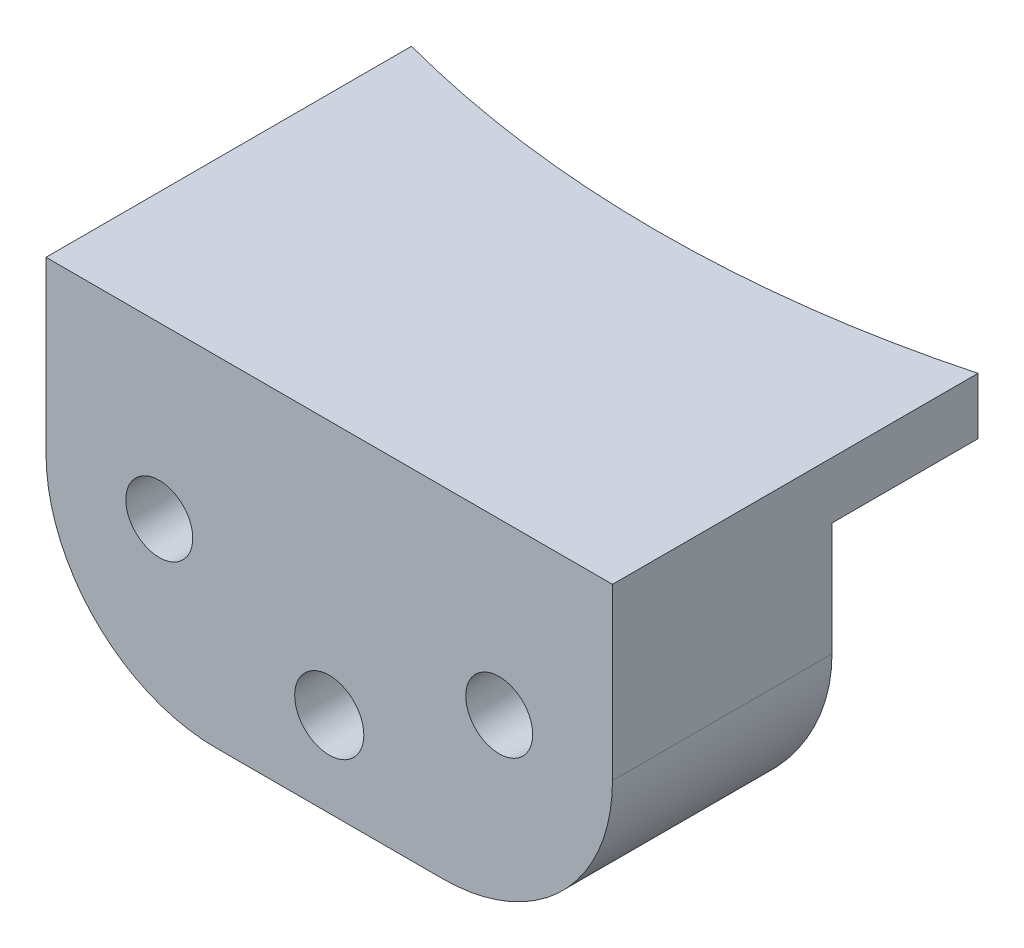
ISO-10303-21;
HEADER;
FILE_DESCRIPTION(('STEP AP214'),'2;1');
FILE_NAME('part.step','',(''),(''),'','','');
FILE_SCHEMA(('AUTOMOTIVE_DESIGN { 1 0 10303 214 1 1 1 1 }'));
ENDSEC;
DATA;
#1=APPLICATION_CONTEXT('core data for automotive mechanical design processes');
#2=APPLICATION_PROTOCOL_DEFINITION('international standard','automotive_design',2000,#1);
#3=PRODUCT_CONTEXT('',#1,'mechanical');
#4=PRODUCT('Part','Part','',(#3));
#5=PRODUCT_RELATED_PRODUCT_CATEGORY('part','',(#4));
#6=PRODUCT_DEFINITION_FORMATION('','',#4);
#7=PRODUCT_DEFINITION_CONTEXT('part definition',#1,'design');
#8=PRODUCT_DEFINITION('design','',#6,#7);
#9=PRODUCT_DEFINITION_SHAPE('','',#8);
#10=(LENGTH_UNIT() NAMED_UNIT(*) SI_UNIT(.MILLI.,.METRE.));
#11=(NAMED_UNIT(*) PLANE_ANGLE_UNIT() SI_UNIT($,.RADIAN.));
#12=(NAMED_UNIT(*) SI_UNIT($,.STERADIAN.) SOLID_ANGLE_UNIT());
#13=UNCERTAINTY_MEASURE_WITH_UNIT(LENGTH_MEASURE(1.E-05),#10,'distance_accuracy_value','');
#14=(GEOMETRIC_REPRESENTATION_CONTEXT(3) GLOBAL_UNCERTAINTY_ASSIGNED_CONTEXT((#13)) GLOBAL_UNIT_ASSIGNED_CONTEXT((#10,
#11,#12)) REPRESENTATION_CONTEXT('',''));
#15=CARTESIAN_POINT('',(0.,0.,0.));
#16=DIRECTION('',(0.,0.,1.));
#17=DIRECTION('',(1.,0.,0.));
#18=AXIS2_PLACEMENT_3D('',#15,#16,#17);
#19=CARTESIAN_POINT('',(0.,12.7,0.));
#20=DIRECTION('',(0.,-1.,0.));
#21=DIRECTION('',(0.,0.,-1.));
#22=AXIS2_PLACEMENT_3D('',#19,#20,#21);
#23=CYLINDRICAL_SURFACE('',#22,55.5625);
#24=CARTESIAN_POINT('',(-9.120000048,7.62,54.8089135576913));
#25=CARTESIAN_POINT('',(-9.11999621102808,7.53655292794151,54.808914369063));
#26=CARTESIAN_POINT('',(-9.1130116596539,7.45304518503125,54.8100778183066));
#27=CARTESIAN_POINT('',(-9.08526335183245,7.28834719222203,54.8146840362341));
#28=CARTESIAN_POINT('',(-9.06448303718543,7.20715984964252,54.8181295439196));
#29=CARTESIAN_POINT('',(-9.00978951623179,7.04952957992192,54.8271453048958));
#30=CARTESIAN_POINT('',(-8.97588675838436,6.97308293414909,54.8327138676975));
#31=CARTESIAN_POINT('',(-8.89597088898424,6.82701224277382,54.8457358352249));
#32=CARTESIAN_POINT('',(-8.84996036921445,6.75738674141171,54.853188836555));
#33=CARTESIAN_POINT('',(-8.74682308996114,6.62638789473792,54.8697296303837));
#34=CARTESIAN_POINT('',(-8.68962455877084,6.56507240342277,54.8788279476088));
#35=CARTESIAN_POINT('',(-8.56594689860326,6.45288523053285,54.8982683825637));
#36=CARTESIAN_POINT('',(-8.49946685646346,6.40201457779287,54.9086106226632));
#37=CARTESIAN_POINT('',(-8.35821882624504,6.31150671653882,54.9302898588455));
#38=CARTESIAN_POINT('',(-8.28335874462302,6.27201576909301,54.9416375490693));
#39=CARTESIAN_POINT('',(-8.12813648430618,6.20617332052651,54.9648156252162));
#40=CARTESIAN_POINT('',(-8.04777401183393,6.17982252159284,54.9766460368985));
#41=CARTESIAN_POINT('',(-7.8830581811966,6.14080220393394,55.0005070953716));
#42=CARTESIAN_POINT('',(-7.79867596702962,6.12825489872769,55.0125385882068));
#43=CARTESIAN_POINT('',(-7.62896594577147,6.11761900363238,55.0363300566384));
#44=CARTESIAN_POINT('',(-7.54363812546803,6.11953061602213,55.048090028434));
#45=CARTESIAN_POINT('',(-7.37433852769907,6.13780253147227,55.0710254674379));
#46=CARTESIAN_POINT('',(-7.2903688021426,6.1541829339868,55.0822000986314));
#47=CARTESIAN_POINT('',(-7.12632355167266,6.20100076410465,55.1036638158295));
#48=CARTESIAN_POINT('',(-7.04624794739732,6.23143790510002,55.1139529198842));
#49=CARTESIAN_POINT('',(-6.89271328707526,6.30536049481368,55.1333644387822));
#50=CARTESIAN_POINT('',(-6.81922296201439,6.3487795088301,55.1424924642665));
#51=CARTESIAN_POINT('',(-6.68056246771594,6.44752373717422,55.1594631773026));
#52=CARTESIAN_POINT('',(-6.61539196462234,6.50284847351224,55.1673059164337));
#53=CARTESIAN_POINT('',(-6.4957676937025,6.62337769766718,55.1815188053812));
#54=CARTESIAN_POINT('',(-6.44123536603558,6.68850293621306,55.1878998159094));
#55=CARTESIAN_POINT('',(-6.34388050871682,6.82710021048834,55.1991756824329));
#56=CARTESIAN_POINT('',(-6.30105753347552,6.90057192844891,55.2040705949811));
#57=CARTESIAN_POINT('',(-6.22864679112167,7.05323280696333,55.2122874979561));
#58=CARTESIAN_POINT('',(-6.19897041654829,7.13237937913618,55.2156200279374));
#59=CARTESIAN_POINT('',(-6.15330431731042,7.29457488825311,55.220727855855));
#60=CARTESIAN_POINT('',(-6.13731423122947,7.37762372208832,55.2225031949124));
#61=CARTESIAN_POINT('',(-6.11953242671802,7.54489110175352,55.2244765509917));
#62=CARTESIAN_POINT('',(-6.11768119187929,7.62910324784874,55.224681179816));
#63=CARTESIAN_POINT('',(-6.12807442800056,7.7966416528179,55.2235288297159));
#64=CARTESIAN_POINT('',(-6.14031873380357,7.8799679220601,55.2221718690886));
#65=CARTESIAN_POINT('',(-6.17852065635988,8.04327528197983,55.2179106240388));
#66=CARTESIAN_POINT('',(-6.2044630596534,8.12325997775687,55.2150080561771));
#67=CARTESIAN_POINT('',(-6.26929091435104,8.27772387211562,55.2076847510786));
#68=CARTESIAN_POINT('',(-6.308176410796,8.35220305153752,55.2032640085586));
#69=CARTESIAN_POINT('',(-6.39784706286642,8.49371212941183,55.1929433196978));
#70=CARTESIAN_POINT('',(-6.44865607028759,8.56072669413083,55.1870404067448));
#71=CARTESIAN_POINT('',(-6.56065466948054,8.68527081342173,55.1738378929584));
#72=CARTESIAN_POINT('',(-6.62184447729637,8.7428001705394,55.1665382630562));
#73=CARTESIAN_POINT('',(-6.7531756981385,8.84706174142647,55.1506157082599));
#74=CARTESIAN_POINT('',(-6.82336057399495,8.89373821129063,55.1419863142163));
#75=CARTESIAN_POINT('',(-6.97042707443464,8.97465871653877,55.1235887639194));
#76=CARTESIAN_POINT('',(-7.04730893701326,9.00890230986346,55.1138205671916));
#77=CARTESIAN_POINT('',(-7.20617478495063,9.06425610064247,55.0932746083916));
#78=CARTESIAN_POINT('',(-7.28819189011866,9.08526869760745,55.082490003281));
#79=CARTESIAN_POINT('',(-7.45449870124348,9.1132248258205,55.0602296795355));
#80=CARTESIAN_POINT('',(-7.53878851298812,9.12016770101464,55.0487539286989));
#81=CARTESIAN_POINT('',(-7.70790703337021,9.11982498652059,55.0253297617587));
#82=CARTESIAN_POINT('',(-7.79273514244896,9.11243430139356,55.0133784885212));
#83=CARTESIAN_POINT('',(-7.9599222586588,9.0834383218984,54.9894369745559));
#84=CARTESIAN_POINT('',(-8.04228118166594,9.06183254380326,54.9774467325159));
#85=CARTESIAN_POINT('',(-8.20251248595899,9.0048953100707,54.9537695066501));
#86=CARTESIAN_POINT('',(-8.28036696096295,8.96951289010585,54.9420838227698));
#87=CARTESIAN_POINT('',(-8.42902662111341,8.88599529703487,54.9194735625234));
#88=CARTESIAN_POINT('',(-8.49983211477352,8.83786068239349,54.9085489528536));
#89=CARTESIAN_POINT('',(-8.63211008475951,8.73034793692299,54.8879090112642));
#90=CARTESIAN_POINT('',(-8.69361404857573,8.67100934107989,54.8781896205283));
#91=CARTESIAN_POINT('',(-8.80577532143928,8.5426066930263,54.8603040664231));
#92=CARTESIAN_POINT('',(-8.85643049777756,8.47354073297715,54.8521382084902));
#93=CARTESIAN_POINT('',(-8.94489321851712,8.3283882145074,54.8377815608655));
#94=CARTESIAN_POINT('',(-8.98282289441274,8.25237786164905,54.8315720329315));
#95=CARTESIAN_POINT('',(-9.04532009021431,8.09498807123796,54.8212969927782));
#96=CARTESIAN_POINT('',(-9.06990496559453,8.01361576242395,54.8172286960081));
#97=CARTESIAN_POINT('',(-9.09826396206031,7.87974052414636,54.8125269419358));
#98=CARTESIAN_POINT('',(-9.1064040030245,7.82814671964131,54.8111744368208));
#99=CARTESIAN_POINT('',(-9.11727322486417,7.72437652074445,54.8093674944471));
#100=CARTESIAN_POINT('',(-9.12000244820928,7.6722001309286,54.8089130501396));
#101=CARTESIAN_POINT('',(-9.120000048,7.62,54.8089135576913));
#102=B_SPLINE_CURVE_WITH_KNOTS('',3,(#24,#25,#26,#27,#28,#29,#30,#31,#32,#33,#34,#35,#36,#37,
#38,#39,#40,#41,#42,#43,#44,#45,#46,#47,#48,#49,#50,#51,#52,#53,#54,#55,#56,#57,#58,#59,#60,#61,
#62,#63,#64,#65,#66,#67,#68,#69,#70,#71,#72,#73,#74,#75,#76,#77,#78,#79,#80,#81,#82,#83,#84,#85,
#86,#87,#88,#89,#90,#91,#92,#93,#94,#95,#96,#97,#98,#99,#100,#101),.UNSPECIFIED.,.T.,.F.,(4,2,2,
2,2,2,2,2,2,2,2,2,2,2,2,2,2,2,2,2,2,2,2,2,2,2,2,2,2,2,2,2,2,2,2,2,2,2,4),(0.,0.25014922180014,
0.500599226325257,0.750850224360897,1.00104769727693,1.25290620658383,1.5047895125035,
1.75977892062891,2.01478195349161,2.27202500441455,2.52927165414888,2.78687622345695,
3.04447554060371,3.30077852312593,3.5570712175423,3.81139296637141,4.06570503585497,
4.31827595943153,4.57084021311309,4.82234072788359,5.07383829586088,5.32505712986663,
5.5762768381013,5.82800343577831,6.0797352730038,6.33273285068457,6.58573942298331,
6.84059112192356,7.09545470401358,7.35219404373389,7.60894212051832,7.86664915756444,
8.12434491055195,8.38114778587567,8.63800109855182,8.892313630998,9.14629462198522,
9.3027761413471,9.45925643247705),.UNSPECIFIED.);
#103=CARTESIAN_POINT('',(-9.120000048,7.62,54.8089135576913));
#104=VERTEX_POINT('',#103);
#105=EDGE_CURVE('E206',#104,#104,#102,.T.);
#106=ORIENTED_EDGE('',*,*,#105,.T.);
#107=EDGE_LOOP('',(#106));
#108=FACE_BOUND('',#107,.T.);
#109=DIRECTION('',(0.,-1.,0.));
#110=VECTOR('',#109,1.);
#111=CARTESIAN_POINT('',(12.7,12.7,54.0916019937476));
#112=LINE('',#111,#110);
#113=CARTESIAN_POINT('',(12.7,12.7,54.0916019937476));
#114=VERTEX_POINT('',#113);
#115=CARTESIAN_POINT('',(12.7,7.62,54.0916019937476));
#116=VERTEX_POINT('',#115);
#117=EDGE_CURVE('E118',#114,#116,#112,.T.);
#118=ORIENTED_EDGE('',*,*,#117,.T.);
#119=CARTESIAN_POINT('',(12.7,7.62,54.0916019937476));
#120=CARTESIAN_POINT('',(12.7000260383111,7.40909228251088,54.0915864318553));
#121=CARTESIAN_POINT('',(12.691244830027,7.19819127799072,54.0936573082442));
#122=CARTESIAN_POINT('',(12.6562582443714,6.77794544077424,54.1018588325241));
#123=CARTESIAN_POINT('',(12.6300551259228,6.56860040988843,54.1079889540934));
#124=CARTESIAN_POINT('',(12.560474630859,6.15330998488749,54.1241820295825));
#125=CARTESIAN_POINT('',(12.5171267660357,5.94735937909786,54.134238225046));
#126=CARTESIAN_POINT('',(12.4136180909257,5.5399487376661,54.158067992428));
#127=CARTESIAN_POINT('',(12.3534572014027,5.33848872319204,54.1718415818658));
#128=CARTESIAN_POINT('',(12.2168079532542,4.94148525143272,54.2028219480953));
#129=CARTESIAN_POINT('',(12.1403214745008,4.74594111589849,54.2200283295903));
#130=CARTESIAN_POINT('',(11.9715783381805,4.36200444670588,54.2575357674463));
#131=CARTESIAN_POINT('',(11.879315869091,4.17361457988681,54.2778379639371));
#132=CARTESIAN_POINT('',(11.6797396456503,3.80533099853923,54.3211331557491));
#133=CARTESIAN_POINT('',(11.5724271486034,3.62543657596365,54.3441259262686));
#134=CARTESIAN_POINT('',(11.3435177564406,3.27529069917125,54.3923679206215));
#135=CARTESIAN_POINT('',(11.2219202556919,3.10503965425281,54.4176172401135));
#136=CARTESIAN_POINT('',(10.9633778569664,2.77281235446111,54.4702984176426));
#137=CARTESIAN_POINT('',(10.8262309491043,2.61099756682606,54.4977572300912));
#138=CARTESIAN_POINT('',(10.5390618609498,2.29948099987531,54.5540189504993));
#139=CARTESIAN_POINT('',(10.3890395653597,2.14977932905461,54.582821870494));
#140=CARTESIAN_POINT('',(10.0771038349884,1.8634220081827,54.6412716227664));
#141=CARTESIAN_POINT('',(9.91518741183268,1.72676965671743,54.6709186659745));
#142=CARTESIAN_POINT('',(9.58058466826317,1.46744437189491,54.7305461139997));
#143=CARTESIAN_POINT('',(9.4078984566224,1.34477129738477,54.7605265154474));
#144=CARTESIAN_POINT('',(9.04939130935338,1.11193492361699,54.8209230629937));
#145=CARTESIAN_POINT('',(8.86337847874969,1.00206611026263,54.8513361394482));
#146=CARTESIAN_POINT('',(8.48268523645505,0.798510974926254,54.9114977279068));
#147=CARTESIAN_POINT('',(8.28800786856427,0.704819025671001,54.9412464678585));
#148=CARTESIAN_POINT('',(7.89131299014792,0.534274703167012,54.9996249202243));
#149=CARTESIAN_POINT('',(7.68929784430577,0.457416960058029,55.0282549870771));
#150=CARTESIAN_POINT('',(7.27936153832026,0.321103346367203,55.0839825765294));
#151=CARTESIAN_POINT('',(7.07144172028111,0.261643555497589,55.1110804432681));
#152=CARTESIAN_POINT('',(6.57017863524608,0.141148151241185,55.1734529444688));
#153=CARTESIAN_POINT('',(6.27469938158129,0.0882796324289929,55.2078704229079));
#154=CARTESIAN_POINT('',(5.82835833976299,0.0353549150312618,55.2561682371208));
#155=CARTESIAN_POINT('',(5.67910944207982,0.0221097115495181,55.2717080069023));
#156=CARTESIAN_POINT('',(5.37994052929068,0.00443212993861692,55.301629822507));
#157=CARTESIAN_POINT('',(5.23002036829238,1.77112671882109E-06,55.3160116023325));
#158=CARTESIAN_POINT('',(5.08000000000001,0.,55.3297840791919));
#159=B_SPLINE_CURVE_WITH_KNOTS('',3,(#119,#120,#121,#122,#123,#124,#125,#126,#127,#128,#129,
#130,#131,#132,#133,#134,#135,#136,#137,#138,#139,#140,#141,#142,#143,#144,#145,#146,#147,#148,
#149,#150,#151,#152,#153,#154,#155,#156,#157,#158),.UNSPECIFIED.,.F.,.F.,(4,2,2,2,2,2,2,2,2,2,2,
2,2,2,2,2,2,2,2,4),(0.,0.632520161662018,1.26495832682647,1.8963125613406,2.52766977134909,
3.15895432051167,3.79047192379489,4.42193680044215,5.05342845859494,5.69434709735375,
6.33527147606941,6.9763574401194,7.61743693036134,8.27116176835798,8.9246587418963,
9.57794695509437,10.2310878490261,11.1351016113192,11.5867982394864,12.0385983310567),.UNSPECIFIED.);
#160=CARTESIAN_POINT('',(5.08000000000001,0.,55.3297840791919));
#161=VERTEX_POINT('',#160);
#162=EDGE_CURVE('E52',#116,#161,#159,.T.);
#163=ORIENTED_EDGE('',*,*,#162,.T.);
#164=CARTESIAN_POINT('',(0.,0.,0.));
#165=DIRECTION('',(0.,1.,0.));
#166=DIRECTION('',(0.,0.,1.));
#167=AXIS2_PLACEMENT_3D('',#164,#165,#166);
#168=CIRCLE('',#167,55.5625);
#169=CARTESIAN_POINT('',(-5.07999999999999,0.,55.3297840791919));
#170=VERTEX_POINT('',#169);
#171=EDGE_CURVE('E212',#170,#161,#168,.T.);
#172=ORIENTED_EDGE('',*,*,#171,.F.);
#173=CARTESIAN_POINT('',(-5.07999999999999,0.,55.3297840791919));
#174=CARTESIAN_POINT('',(-5.29562410537944,-2.3387445512298E-05,55.3099997188466));
#175=CARTESIAN_POINT('',(-5.51112042097036,0.00915118387227308,55.28893094684));
#176=CARTESIAN_POINT('',(-5.94029978490938,0.0456641324498058,55.2444603897414));
#177=CARTESIAN_POINT('',(-6.15398306005883,0.0730002028392074,55.2210589012716));
#178=CARTESIAN_POINT('',(-6.57777677106924,0.145560073441101,55.17218326696));
#179=CARTESIAN_POINT('',(-6.78789122985313,0.190762115183339,55.1467116721074));
#180=CARTESIAN_POINT('',(-7.20334697324967,0.298671325154473,55.0939835295491));
#181=CARTESIAN_POINT('',(-7.40868821288622,0.36137865825626,55.0667269650336));
#182=CARTESIAN_POINT('',(-7.81316032874045,0.503806931061598,55.0107954997));
#183=CARTESIAN_POINT('',(-8.0122917751137,0.583526303492762,54.9821207297242));
#184=CARTESIAN_POINT('',(-8.40307988269979,0.759426332809615,54.9237535370508));
#185=CARTESIAN_POINT('',(-8.59473376381003,0.855613041848489,54.8940607434247));
#186=CARTESIAN_POINT('',(-8.96916473472196,1.06373055449219,54.8341265856855));
#187=CARTESIAN_POINT('',(-9.15194314337477,1.17565900926147,54.803885303998));
#188=CARTESIAN_POINT('',(-9.50742384205972,1.41450459468329,54.7433357867528));
#189=CARTESIAN_POINT('',(-9.6801258709567,1.54142211352848,54.7130275494811));
#190=CARTESIAN_POINT('',(-10.0157436611376,1.8105672966892,54.6525902226809));
#191=CARTESIAN_POINT('',(-10.178560274216,1.95291950983817,54.6224650375705));
#192=CARTESIAN_POINT('',(-10.4916022900358,2.2510448399384,54.5632025409557));
#193=CARTESIAN_POINT('',(-10.6418276177546,2.40681803684473,54.534065235338));
#194=CARTESIAN_POINT('',(-10.9286385521242,2.73076335238247,54.4773131355335));
#195=CARTESIAN_POINT('',(-11.0652217035749,2.89893769343099,54.4496986158036));
#196=CARTESIAN_POINT('',(-11.3237088821085,3.24651137039552,54.3965296708766));
#197=CARTESIAN_POINT('',(-11.4456134757626,3.42591027265331,54.3709751661785));
#198=CARTESIAN_POINT('',(-11.6733659620802,3.79396175448207,54.322531608219));
#199=CARTESIAN_POINT('',(-11.779276353217,3.98257429146174,54.2996322657756));
#200=CARTESIAN_POINT('',(-11.9747598790164,4.36831989412749,54.2568571196159));
#201=CARTESIAN_POINT('',(-12.0643394035554,4.56544958974535,54.2369801338313));
#202=CARTESIAN_POINT('',(-12.2264480386432,4.96679723694908,54.2006667902396));
#203=CARTESIAN_POINT('',(-12.298985918394,5.17101148064087,54.1842286633611));
#204=CARTESIAN_POINT('',(-12.4264455428757,5.58503866064816,54.1551393616813));
#205=CARTESIAN_POINT('',(-12.481372311498,5.79484998176211,54.1424871069596));
#206=CARTESIAN_POINT('',(-12.5846109902038,6.27148553512671,54.1185967336665));
#207=CARTESIAN_POINT('',(-12.6278666930291,6.53949244771971,54.1084960034694));
#208=CARTESIAN_POINT('',(-12.6711345757469,6.94364739409365,54.0983727821397));
#209=CARTESIAN_POINT('',(-12.6819545804616,7.07867117232856,54.0958363640718));
#210=CARTESIAN_POINT('',(-12.6963868481978,7.34911939552043,54.0924504850006));
#211=CARTESIAN_POINT('',(-12.6999993811438,7.48454382528249,54.0916009608221));
#212=CARTESIAN_POINT('',(-12.7,7.62,54.0916019937476));
#213=B_SPLINE_CURVE_WITH_KNOTS('',3,(#173,#174,#175,#176,#177,#178,#179,#180,#181,#182,#183,
#184,#185,#186,#187,#188,#189,#190,#191,#192,#193,#194,#195,#196,#197,#198,#199,#200,#201,#202,
#203,#204,#205,#206,#207,#208,#209,#210,#211,#212),.UNSPECIFIED.,.F.,.F.,(4,2,2,2,2,2,2,2,2,2,2,
2,2,2,2,2,2,2,2,4),(0.,0.649377166381036,1.2986718647569,1.94717822973769,2.59569070285607,
3.24414345607736,3.89283504534495,4.5414299454298,5.19004164676454,5.844343678106,
6.4986496077006,7.15307308220284,7.80747128880387,8.45924226245724,9.11075766384159,
9.76193707386063,10.4129305574326,11.2260902634517,11.6323599716372,12.0386144644754),.UNSPECIFIED.);
#214=CARTESIAN_POINT('',(-12.7,7.62,54.0916019937476));
#215=VERTEX_POINT('',#214);
#216=EDGE_CURVE('E59',#170,#215,#213,.T.);
#217=ORIENTED_EDGE('',*,*,#216,.T.);
#218=DIRECTION('',(0.,-1.,0.));
#219=VECTOR('',#218,1.);
#220=CARTESIAN_POINT('',(-12.7,12.7,54.0916019937476));
#221=LINE('',#220,#219);
#222=CARTESIAN_POINT('',(-12.7,12.7,54.0916019937476));
#223=VERTEX_POINT('',#222);
#224=EDGE_CURVE('E245',#223,#215,#221,.T.);
#225=ORIENTED_EDGE('',*,*,#224,.F.);
#226=CARTESIAN_POINT('',(0.,12.7,0.));
#227=DIRECTION('',(0.,1.,0.));
#228=DIRECTION('',(0.,0.,1.));
#229=AXIS2_PLACEMENT_3D('',#226,#227,#228);
#230=CIRCLE('',#229,55.5625);
#231=EDGE_CURVE('E247',#223,#114,#230,.T.);
#232=ORIENTED_EDGE('',*,*,#231,.T.);
#233=EDGE_LOOP('',(#118,#163,#172,#217,#225,#232));
#234=FACE_BOUND('',#233,.T.);
#235=CARTESIAN_POINT('',(6.119999952,7.62,55.2244240063898));
#236=CARTESIAN_POINT('',(6.12000371731656,7.70384911757433,55.2244237614702));
#237=CARTESIAN_POINT('',(6.12705488577725,7.78775884632044,55.2236435883633));
#238=CARTESIAN_POINT('',(6.15507775222119,7.95326138606132,55.2205271175357));
#239=CARTESIAN_POINT('',(6.17606611345703,8.03485130158077,55.21818895708));
#240=CARTESIAN_POINT('',(6.23134089348511,8.19328710860472,55.2119784627386));
#241=CARTESIAN_POINT('',(6.26561961049595,8.27013571786113,55.208107017366));
#242=CARTESIAN_POINT('',(6.34646219195674,8.41694635401635,55.1988720084782));
#243=CARTESIAN_POINT('',(6.39302309548422,8.48691003512194,55.193508804571));
#244=CARTESIAN_POINT('',(6.49720301893745,8.6181806596991,55.1813420252037));
#245=CARTESIAN_POINT('',(6.55484793560669,8.67946673474614,55.1745350726457));
#246=CARTESIAN_POINT('',(6.67945853919748,8.79149585102086,55.1595881945335));
#247=CARTESIAN_POINT('',(6.74642481230449,8.84223822869394,55.1514481851427));
#248=CARTESIAN_POINT('',(6.88817667682041,8.93206570640083,55.133923770131));
#249=CARTESIAN_POINT('',(6.96300581309714,8.97108071180503,55.1245323480741));
#250=CARTESIAN_POINT('',(7.1180206576917,9.03600817991073,55.1047301847482));
#251=CARTESIAN_POINT('',(7.19820657502636,9.06192013100428,55.0943194036972));
#252=CARTESIAN_POINT('',(7.36230524458389,9.10011628138092,55.07263172448));
#253=CARTESIAN_POINT('',(7.44624178712253,9.11229486496705,55.0613488174972));
#254=CARTESIAN_POINT('',(7.6148991048308,9.1223687214044,55.0382772492283));
#255=CARTESIAN_POINT('',(7.69961991249936,9.12026339967913,55.0264885669092));
#256=CARTESIAN_POINT('',(7.8680395448931,9.10178961240356,55.0026603180449));
#257=CARTESIAN_POINT('',(7.95172782244038,9.08532636073442,54.9906196042509));
#258=CARTESIAN_POINT('',(8.11514256208299,9.03847077901288,54.9667416820578));
#259=CARTESIAN_POINT('',(8.19486892777359,9.00807811020147,54.9549044786153));
#260=CARTESIAN_POINT('',(8.34823425074134,8.93412889579789,54.9318161124789));
#261=CARTESIAN_POINT('',(8.42186232522994,8.89054943590729,54.9205660101945));
#262=CARTESIAN_POINT('',(8.56075041279862,8.79143775105458,54.8990883764091));
#263=CARTESIAN_POINT('',(8.62601060802323,8.73590578633442,54.8888608226511));
#264=CARTESIAN_POINT('',(8.74588871435486,8.6147827514937,54.8698870699567));
#265=CARTESIAN_POINT('',(8.80056648060806,8.54925224458237,54.8611325783816));
#266=CARTESIAN_POINT('',(8.89811094428881,8.40973172755988,54.8453961353485));
#267=CARTESIAN_POINT('',(8.94097842120882,8.33574227620494,54.838414066911));
#268=CARTESIAN_POINT('',(9.01315738453678,8.18232986303454,54.8265969096645));
#269=CARTESIAN_POINT('',(9.04262190309225,8.10298077024724,54.821737610324));
#270=CARTESIAN_POINT('',(9.08781737264019,7.94036309728095,54.8142637609483));
#271=CARTESIAN_POINT('',(9.10354931563693,7.85709480067274,54.8116490487703));
#272=CARTESIAN_POINT('',(9.12069193401878,7.68999738248732,54.8087991160742));
#273=CARTESIAN_POINT('',(9.1222601897678,7.60618484098529,54.8085377135388));
#274=CARTESIAN_POINT('',(9.11143977185135,7.43949296308535,54.810337534858));
#275=CARTESIAN_POINT('',(9.09905153392604,7.35661359763405,54.8123986861994));
#276=CARTESIAN_POINT('',(9.06076780780896,7.19443381441877,54.8187400769808));
#277=CARTESIAN_POINT('',(9.0349195582726,7.11512192720396,54.8230125553305));
#278=CARTESIAN_POINT('',(8.97052287672623,6.9619813814523,54.833586278161));
#279=CARTESIAN_POINT('',(8.93197412701045,6.88815286013967,54.839887573393));
#280=CARTESIAN_POINT('',(8.84302757044934,6.7475506431167,54.8543006939865));
#281=CARTESIAN_POINT('',(8.79255583866518,6.68082488986363,54.8624237983577));
#282=CARTESIAN_POINT('',(8.6813608909769,6.55677239809934,54.8801288379356));
#283=CARTESIAN_POINT('',(8.62063703778261,6.49944624432095,54.8897108638277));
#284=CARTESIAN_POINT('',(8.48986557786433,6.39508545876161,54.9100902546704));
#285=CARTESIAN_POINT('',(8.41971451612138,6.34818304648185,54.920900863234));
#286=CARTESIAN_POINT('',(8.27264349246052,6.26681089808908,54.9432461962801));
#287=CARTESIAN_POINT('',(8.19572312279707,6.2323419115351,54.9547809643699));
#288=CARTESIAN_POINT('',(8.03641281237598,6.17646264717463,54.9783049950258));
#289=CARTESIAN_POINT('',(7.95397387796316,6.15519344207191,54.9902977604776));
#290=CARTESIAN_POINT('',(7.78668039804671,6.12687723626687,55.0142359095637));
#291=CARTESIAN_POINT('',(7.70182577777469,6.11983067625903,55.0261812917185));
#292=CARTESIAN_POINT('',(7.5317661737021,6.12017605503529,55.0497166212871));
#293=CARTESIAN_POINT('',(7.4465610793216,6.12762273950597,55.0613050524015));
#294=CARTESIAN_POINT('',(7.27855757368912,6.15689121340597,55.0837652215557));
#295=CARTESIAN_POINT('',(7.19575913915165,6.17871286370284,55.0946369665311));
#296=CARTESIAN_POINT('',(7.03523419476713,6.23606038319239,55.1153646384307));
#297=CARTESIAN_POINT('',(6.95749156682349,6.27153992552357,55.1252238581024));
#298=CARTESIAN_POINT('',(6.80904581055884,6.35524204378955,55.143756701438));
#299=CARTESIAN_POINT('',(6.73834215204492,6.40346365895802,55.1524304144156));
#300=CARTESIAN_POINT('',(6.60655160855841,6.51090238307935,55.1683719558775));
#301=CARTESIAN_POINT('',(6.54539736353703,6.57003539231792,55.1756497230196));
#302=CARTESIAN_POINT('',(6.43387095984251,6.69788629740638,55.1887658229102));
#303=CARTESIAN_POINT('',(6.38350105665956,6.76660619335099,55.194603854584));
#304=CARTESIAN_POINT('',(6.29537120482434,6.91114364249071,55.204725052693));
#305=CARTESIAN_POINT('',(6.25752656286639,6.98690889422442,55.2090186799864));
#306=CARTESIAN_POINT('',(6.19512698152663,7.14372176070107,55.216055667924));
#307=CARTESIAN_POINT('',(6.17055563365224,7.22476271401913,55.2188009428328));
#308=CARTESIAN_POINT('',(6.14201465203281,7.35860982950822,55.2219808989417));
#309=CARTESIAN_POINT('',(6.1337698354677,7.41053209140411,55.2228965647646));
#310=CARTESIAN_POINT('',(6.12276131383579,7.51496164009855,55.2241181943347));
#311=CARTESIAN_POINT('',(6.11999759304702,7.56746892521859,55.2244241598307));
#312=CARTESIAN_POINT('',(6.119999952,7.62,55.2244240063898));
#313=B_SPLINE_CURVE_WITH_KNOTS('',3,(#235,#236,#237,#238,#239,#240,#241,#242,#243,#244,#245,
#246,#247,#248,#249,#250,#251,#252,#253,#254,#255,#256,#257,#258,#259,#260,#261,#262,#263,#264,
#265,#266,#267,#268,#269,#270,#271,#272,#273,#274,#275,#276,#277,#278,#279,#280,#281,#282,#283,
#284,#285,#286,#287,#288,#289,#290,#291,#292,#293,#294,#295,#296,#297,#298,#299,#300,#301,#302,
#303,#304,#305,#306,#307,#308,#309,#310,#311,#312),.UNSPECIFIED.,.T.,.F.,(4,2,2,2,2,2,2,2,2,2,2,
2,2,2,2,2,2,2,2,2,2,2,2,2,2,2,2,2,2,2,2,2,2,2,2,2,2,2,4),(0.,0.251355146459634,
0.503011354521981,0.754521944878947,1.00597195776034,1.25801675951987,1.51007741860735,
1.76361598655417,2.01716445313449,2.27264979862722,2.52814577892227,2.78534133363927,
3.04254314360262,3.30019447746106,3.55784020204283,3.8139831023575,4.07010909289871,
4.32323238593749,4.57633739251771,4.82662292218212,5.07690063781821,5.32630585152127,
5.57571730462374,5.8267177421904,6.07773378814094,6.33177205621674,6.58582563663413,
6.84254965614398,7.09928163023066,7.35698524658097,7.61468636870563,7.87152097636981,
8.12833622394515,8.38324901118247,8.63821506016505,8.89142007300641,9.1443113524185,
9.3017846121462,9.45925742017735),.UNSPECIFIED.);
#314=CARTESIAN_POINT('',(6.119999952,7.62,55.2244240063898));
#315=VERTEX_POINT('',#314);
#316=EDGE_CURVE('E177',#315,#315,#313,.T.);
#317=ORIENTED_EDGE('',*,*,#316,.F.);
#318=EDGE_LOOP('',(#317));
#319=FACE_BOUND('',#318,.T.);
#320=CARTESIAN_POINT('',(-1.549999948,3.81,55.5408759960734));
#321=CARTESIAN_POINT('',(-1.54999609342308,3.72295399858556,55.5408762879376));
#322=CARTESIAN_POINT('',(-1.54264274943833,3.63584531172755,55.5410828273719));
#323=CARTESIAN_POINT('',(-1.51341154088029,3.4640282034798,55.5418868719789));
#324=CARTESIAN_POINT('',(-1.49151630866288,3.37932277863846,55.5424848446351));
#325=CARTESIAN_POINT('',(-1.43382623459725,3.21482617714643,55.5440039648012));
#326=CARTESIAN_POINT('',(-1.39803817080387,3.13503262604408,55.5449249546958));
#327=CARTESIAN_POINT('',(-1.31358799072566,2.9826082573854,55.5469861305193));
#328=CARTESIAN_POINT('',(-1.26492902506042,2.90997569288289,55.5481262627864));
#329=CARTESIAN_POINT('',(-1.15609444900336,2.77388260417837,55.5504978075962));
#330=CARTESIAN_POINT('',(-1.09591483952437,2.71042527838367,55.5517292517442));
#331=CARTESIAN_POINT('',(-0.96575402580595,2.5945108251007,55.5541443396033));
#332=CARTESIAN_POINT('',(-0.895772432158447,2.54205413484676,55.555327981413));
#333=CARTESIAN_POINT('',(-0.747983265369765,2.44962576246726,55.5575141755787));
#334=CARTESIAN_POINT('',(-0.670174563569678,2.40965588434542,55.5585167017595));
#335=CARTESIAN_POINT('',(-0.50894795551528,2.34334752685525,55.5602274195025));
#336=CARTESIAN_POINT('',(-0.425530070230744,2.3170089965297,55.5609356121649));
#337=CARTESIAN_POINT('',(-0.25547612504719,2.27871755060328,55.5619776666209));
#338=CARTESIAN_POINT('',(-0.168840913604445,2.26676086968102,55.562311626391));
#339=CARTESIAN_POINT('',(0.00520760469671878,2.25756093395939,55.5625678972344));
#340=CARTESIAN_POINT('',(0.0926209086801756,2.26031762481834,55.562490209828));
#341=CARTESIAN_POINT('',(0.265718751092176,2.28046298643949,55.5619320279844));
#342=CARTESIAN_POINT('',(0.351403763508657,2.29784758801998,55.5614516455687));
#343=CARTESIAN_POINT('',(0.518638680263154,2.3467489937465,55.5601423456397));
#344=CARTESIAN_POINT('',(0.600188576151127,2.37826582677022,55.5593134274143));
#345=CARTESIAN_POINT('',(0.756851416373593,2.45454171233959,55.5574002904637));
#346=CARTESIAN_POINT('',(0.83196345211507,2.49930263010373,55.5563160357828));
#347=CARTESIAN_POINT('',(0.973608433072614,2.60079468871591,55.5540144253013));
#348=CARTESIAN_POINT('',(1.04014136180373,2.65752585256449,55.5527970692449));
#349=CARTESIAN_POINT('',(1.16276322857611,2.7813710499755,55.5503659657128));
#350=CARTESIAN_POINT('',(1.21884859959014,2.84848861541882,55.5491522196082));
#351=CARTESIAN_POINT('',(1.31895582339724,2.99118892337766,55.5468655925454));
#352=CARTESIAN_POINT('',(1.36297767427109,3.06677166723991,55.5457927116096));
#353=CARTESIAN_POINT('',(1.43770783347422,3.22425879138393,55.5439088168706));
#354=CARTESIAN_POINT('',(1.46841602769312,3.30616322584136,55.5430978053119));
#355=CARTESIAN_POINT('',(1.51564488496599,3.47396784108615,55.5418291896697));
#356=CARTESIAN_POINT('',(1.5321655815466,3.55986801243064,55.541371584751));
#357=CARTESIAN_POINT('',(1.5505461049613,3.73319466341868,55.540861529535));
#358=CARTESIAN_POINT('',(1.55241087244346,3.82062061874487,55.5408089427024));
#359=CARTESIAN_POINT('',(1.54143947703649,3.994544363316,55.5411144968327));
#360=CARTESIAN_POINT('',(1.52860332878562,4.08104215348506,55.5414726373865));
#361=CARTESIAN_POINT('',(1.48859856695704,4.25064041318624,55.542559148112));
#362=CARTESIAN_POINT('',(1.46143219727584,4.33374141241012,55.5432874603198));
#363=CARTESIAN_POINT('',(1.3935404285462,4.49420339634853,55.5450321611219));
#364=CARTESIAN_POINT('',(1.352815006138,4.57156437117377,55.5460485502126));
#365=CARTESIAN_POINT('',(1.25894844930174,4.71837305537129,55.5482551590617));
#366=CARTESIAN_POINT('',(1.20580398695866,4.78781863623105,55.5494454253817));
#367=CARTESIAN_POINT('',(1.08861281880461,4.91680384197243,55.5518654423468));
#368=CARTESIAN_POINT('',(1.02456608833954,4.97634344445234,55.5530951930813));
#369=CARTESIAN_POINT('',(0.887367290917661,5.08384304617487,55.5554559438528));
#370=CARTESIAN_POINT('',(0.81421272685807,5.13179985911166,55.5565869166625));
#371=CARTESIAN_POINT('',(0.660887630077876,5.21475076249205,55.5586222310486));
#372=CARTESIAN_POINT('',(0.580717112029712,5.24974488004367,55.559526573099));
#373=CARTESIAN_POINT('',(0.415647881765206,5.30577145520478,55.5610065510763));
#374=CARTESIAN_POINT('',(0.330749871485956,5.32680597957216,55.5615822356602));
#375=CARTESIAN_POINT('',(0.158625630224084,5.35432305618019,55.5623401960945));
#376=CARTESIAN_POINT('',(0.0713994004361376,5.36080561588771,55.5625224721467));
#377=CARTESIAN_POINT('',(-0.102873323572012,5.3590345006712,55.5624730706783));
#378=CARTESIAN_POINT('',(-0.189919868941074,5.35078585026795,55.5622415343007));
#379=CARTESIAN_POINT('',(-0.361392132182456,5.31979678795334,55.5613908760816));
#380=CARTESIAN_POINT('',(-0.445817844853064,5.29705634728127,55.5607717534708));
#381=CARTESIAN_POINT('',(-0.609654018374143,5.23772983718235,55.5592156661925));
#382=CARTESIAN_POINT('',(-0.689064393434429,5.20114353098896,55.5582786960898));
#383=CARTESIAN_POINT('',(-0.840613805404238,5.115165791625,55.5561925019119));
#384=CARTESIAN_POINT('',(-0.912753108190607,5.06577482691062,55.5550432856022));
#385=CARTESIAN_POINT('',(-1.04773517858151,4.95557584161627,55.5526617158147));
#386=CARTESIAN_POINT('',(-1.11057576144079,4.89476514554809,55.5514293428979));
#387=CARTESIAN_POINT('',(-1.22517297410786,4.76343926015758,55.5490202639785));
#388=CARTESIAN_POINT('',(-1.27692685410335,4.69292167036163,55.5478435718425));
#389=CARTESIAN_POINT('',(-1.36788920752996,4.54415821713552,55.5456781700201));
#390=CARTESIAN_POINT('',(-1.4070898177431,4.4659075497943,55.5446895783142));
#391=CARTESIAN_POINT('',(-1.47175152849468,4.30399326718506,55.543014050582));
#392=CARTESIAN_POINT('',(-1.49722902485511,4.22033624571266,55.5423267547631));
#393=CARTESIAN_POINT('',(-1.52696430802899,4.08179178077485,55.5415151746475));
#394=CARTESIAN_POINT('',(-1.53559181559179,4.02780373617808,55.5412765228429));
#395=CARTESIAN_POINT('',(-1.54711084422873,3.91921868864245,55.540956842003));
#396=CARTESIAN_POINT('',(-1.55000236676119,3.86462168585841,55.5408758129275));
#397=CARTESIAN_POINT('',(-1.549999948,3.81,55.5408759960734));
#398=B_SPLINE_CURVE_WITH_KNOTS('',3,(#320,#321,#322,#323,#324,#325,#326,#327,#328,#329,#330,
#331,#332,#333,#334,#335,#336,#337,#338,#339,#340,#341,#342,#343,#344,#345,#346,#347,#348,#349,
#350,#351,#352,#353,#354,#355,#356,#357,#358,#359,#360,#361,#362,#363,#364,#365,#366,#367,#368,
#369,#370,#371,#372,#373,#374,#375,#376,#377,#378,#379,#380,#381,#382,#383,#384,#385,#386,#387,
#388,#389,#390,#391,#392,#393,#394,#395,#396,#397),.UNSPECIFIED.,.T.,.F.,(4,2,2,2,2,2,2,2,2,2,2,
2,2,2,2,2,2,2,2,2,2,2,2,2,2,2,2,2,2,2,2,2,2,2,2,2,2,2,4),(0.,0.260938628906029,
0.522189463369566,0.783312998262134,1.04437267276583,1.30552313209716,1.5666839692212,
1.8278825195319,2.08908009341352,2.3502092680928,2.61133747833031,2.87239307211568,
3.13344919934247,3.39454210968265,3.65563552171132,3.91681791407,4.17800034798097,
4.43918502042358,4.70036907565607,4.96146507957072,5.22256082350241,5.48361569590997,
5.7446710180695,6.005796375287,6.26692232301459,6.52812002218735,6.78931717513136,
7.05047564845389,7.31163398777135,7.57270326822043,7.833773066795,8.09484732990718,
8.35591204301066,8.6170379965172,8.8782286417654,9.13958257513029,9.40062355682873,
9.56436354727606,9.72810349609427),.UNSPECIFIED.);
#399=CARTESIAN_POINT('',(-1.549999948,3.81,55.5408759960734));
#400=VERTEX_POINT('',#399);
#401=EDGE_CURVE('E169',#400,#400,#398,.T.);
#402=ORIENTED_EDGE('',*,*,#401,.T.);
#403=EDGE_LOOP('',(#402));
#404=FACE_BOUND('',#403,.T.);
#405=ADVANCED_FACE('F43',(#108,#234,#319,#404),#23,.F.);
#406=CARTESIAN_POINT('',(12.6999999999999,12.7,0.));
#407=DIRECTION('',(1.,0.,0.));
#408=DIRECTION('',(0.,0.,-1.));
#409=AXIS2_PLACEMENT_3D('',#406,#407,#408);
#410=PLANE('',#409);
#411=DIRECTION('',(0.,0.,-1.));
#412=VECTOR('',#411,1.);
#413=CARTESIAN_POINT('',(12.6999999999999,15.24,0.));
#414=LINE('',#413,#412);
#415=CARTESIAN_POINT('',(12.7,15.24,63.9341019937476));
#416=VERTEX_POINT('',#415);
#417=CARTESIAN_POINT('',(12.7,15.24,47.5455587436934));
#418=VERTEX_POINT('',#417);
#419=EDGE_CURVE('E152',#416,#418,#414,.T.);
#420=ORIENTED_EDGE('',*,*,#419,.F.);
#421=DIRECTION('',(0.,1.,0.));
#422=VECTOR('',#421,1.);
#423=CARTESIAN_POINT('',(12.7,7.62,63.9341019937476));
#424=LINE('',#423,#422);
#425=CARTESIAN_POINT('',(12.7,7.62,63.9341019937476));
#426=VERTEX_POINT('',#425);
#427=EDGE_CURVE('E143',#426,#416,#424,.T.);
#428=ORIENTED_EDGE('',*,*,#427,.F.);
#429=DIRECTION('',(0.,0.,1.));
#430=VECTOR('',#429,1.);
#431=CARTESIAN_POINT('',(12.7,7.62,54.0916019937476));
#432=LINE('',#431,#430);
#433=EDGE_CURVE('E67',#426,#116,#432,.F.);
#434=ORIENTED_EDGE('',*,*,#433,.T.);
#435=ORIENTED_EDGE('',*,*,#117,.F.);
#436=DIRECTION('',(0.,0.,-1.));
#437=VECTOR('',#436,1.);
#438=CARTESIAN_POINT('',(12.6999999999999,12.7,0.));
#439=LINE('',#438,#437);
#440=CARTESIAN_POINT('',(12.7,12.7,47.5455587436934));
#441=VERTEX_POINT('',#440);
#442=EDGE_CURVE('E161',#114,#441,#439,.T.);
#443=ORIENTED_EDGE('',*,*,#442,.T.);
#444=DIRECTION('',(0.,-1.,0.));
#445=VECTOR('',#444,1.);
#446=CARTESIAN_POINT('',(12.7,15.24,47.5455587436934));
#447=LINE('',#446,#445);
#448=EDGE_CURVE('E166',#418,#441,#447,.T.);
#449=ORIENTED_EDGE('',*,*,#448,.F.);
#450=EDGE_LOOP('',(#420,#428,#434,#435,#443,#449));
#451=FACE_BOUND('',#450,.T.);
#452=ADVANCED_FACE('F228',(#451),#410,.T.);
#453=CARTESIAN_POINT('',(-12.7,12.7,0.));
#454=DIRECTION('',(1.,0.,0.));
#455=DIRECTION('',(0.,0.,-1.));
#456=AXIS2_PLACEMENT_3D('',#453,#454,#455);
#457=PLANE('',#456);
#458=ORIENTED_EDGE('',*,*,#224,.T.);
#459=DIRECTION('',(0.,0.,1.));
#460=VECTOR('',#459,1.);
#461=CARTESIAN_POINT('',(-12.7,7.62,0.));
#462=LINE('',#461,#460);
#463=CARTESIAN_POINT('',(-12.7,7.62,63.9341019937476));
#464=VERTEX_POINT('',#463);
#465=EDGE_CURVE('E11',#215,#464,#462,.T.);
#466=ORIENTED_EDGE('',*,*,#465,.T.);
#467=DIRECTION('',(0.,-1.,0.));
#468=VECTOR('',#467,1.);
#469=CARTESIAN_POINT('',(-12.7,15.24,63.9341019937476));
#470=LINE('',#469,#468);
#471=CARTESIAN_POINT('',(-12.7,15.24,63.9341019937476));
#472=VERTEX_POINT('',#471);
#473=EDGE_CURVE('E134',#472,#464,#470,.T.);
#474=ORIENTED_EDGE('',*,*,#473,.F.);
#475=DIRECTION('',(0.,0.,1.));
#476=VECTOR('',#475,1.);
#477=CARTESIAN_POINT('',(-12.7,15.24,0.));
#478=LINE('',#477,#476);
#479=CARTESIAN_POINT('',(-12.7,15.24,47.5455587436934));
#480=VERTEX_POINT('',#479);
#481=EDGE_CURVE('E150',#480,#472,#478,.T.);
#482=ORIENTED_EDGE('',*,*,#481,.F.);
#483=DIRECTION('',(0.,-1.,0.));
#484=VECTOR('',#483,1.);
#485=CARTESIAN_POINT('',(-12.7,15.24,47.5455587436934));
#486=LINE('',#485,#484);
#487=CARTESIAN_POINT('',(-12.7,12.7,47.5455587436934));
#488=VERTEX_POINT('',#487);
#489=EDGE_CURVE('E158',#480,#488,#486,.T.);
#490=ORIENTED_EDGE('',*,*,#489,.T.);
#491=DIRECTION('',(0.,0.,1.));
#492=VECTOR('',#491,1.);
#493=CARTESIAN_POINT('',(-12.7,12.7,0.));
#494=LINE('',#493,#492);
#495=EDGE_CURVE('E149',#488,#223,#494,.T.);
#496=ORIENTED_EDGE('',*,*,#495,.T.);
#497=EDGE_LOOP('',(#458,#466,#474,#482,#490,#496));
#498=FACE_BOUND('',#497,.T.);
#499=ADVANCED_FACE('F230',(#498),#457,.F.);
#500=CARTESIAN_POINT('',(0.,0.,0.));
#501=DIRECTION('',(0.,1.,0.));
#502=DIRECTION('',(0.,0.,1.));
#503=AXIS2_PLACEMENT_3D('',#500,#501,#502);
#504=PLANE('',#503);
#505=ORIENTED_EDGE('',*,*,#171,.T.);
#506=DIRECTION('',(0.,0.,1.));
#507=VECTOR('',#506,1.);
#508=CARTESIAN_POINT('',(5.08000000000001,0.,58.8541019937476));
#509=LINE('',#508,#507);
#510=CARTESIAN_POINT('',(5.08000000000001,0.,63.9341019937476));
#511=VERTEX_POINT('',#510);
#512=EDGE_CURVE('E117',#161,#511,#509,.T.);
#513=ORIENTED_EDGE('',*,*,#512,.T.);
#514=DIRECTION('',(1.,0.,0.));
#515=VECTOR('',#514,1.);
#516=CARTESIAN_POINT('',(-5.07999999999999,0.,63.9341019937476));
#517=LINE('',#516,#515);
#518=CARTESIAN_POINT('',(-5.07999999999999,0.,63.9341019937476));
#519=VERTEX_POINT('',#518);
#520=EDGE_CURVE('E121',#519,#511,#517,.T.);
#521=ORIENTED_EDGE('',*,*,#520,.F.);
#522=DIRECTION('',(0.,0.,1.));
#523=VECTOR('',#522,1.);
#524=CARTESIAN_POINT('',(-5.07999999999996,0.,0.));
#525=LINE('',#524,#523);
#526=EDGE_CURVE('E110',#519,#170,#525,.F.);
#527=ORIENTED_EDGE('',*,*,#526,.T.);
#528=EDGE_LOOP('',(#505,#513,#521,#527));
#529=FACE_BOUND('',#528,.T.);
#530=ADVANCED_FACE('F122',(#529),#504,.F.);
#531=CARTESIAN_POINT('',(-7.62,7.62,63.0967428166314));
#532=DIRECTION('',(0.,0.,-1.));
#533=DIRECTION('',(-1.,0.,0.));
#534=AXIS2_PLACEMENT_3D('',#531,#532,#533);
#535=CYLINDRICAL_SURFACE('',#534,1.500000048);
#536=ORIENTED_EDGE('',*,*,#105,.F.);
#537=EDGE_LOOP('',(#536));
#538=FACE_BOUND('',#537,.T.);
#539=CARTESIAN_POINT('',(-7.62,7.62,63.9341019937476));
#540=DIRECTION('',(0.,0.,1.));
#541=DIRECTION('',(1.,0.,0.));
#542=AXIS2_PLACEMENT_3D('',#539,#540,#541);
#543=CIRCLE('',#542,1.500000048);
#544=CARTESIAN_POINT('',(-6.119999952,7.62,63.9341019937476));
#545=VERTEX_POINT('',#544);
#546=EDGE_CURVE('E267',#545,#545,#543,.T.);
#547=ORIENTED_EDGE('',*,*,#546,.T.);
#548=EDGE_LOOP('',(#547));
#549=FACE_BOUND('',#548,.T.);
#550=ADVANCED_FACE('F199',(#538,#549),#535,.F.);
#551=CARTESIAN_POINT('',(7.62,7.62,63.0967428166314));
#552=DIRECTION('',(0.,0.,-1.));
#553=DIRECTION('',(-1.,0.,0.));
#554=AXIS2_PLACEMENT_3D('',#551,#552,#553);
#555=CYLINDRICAL_SURFACE('',#554,1.500000048);
#556=ORIENTED_EDGE('',*,*,#316,.T.);
#557=EDGE_LOOP('',(#556));
#558=FACE_BOUND('',#557,.T.);
#559=CARTESIAN_POINT('',(7.62,7.62,63.9341019937476));
#560=DIRECTION('',(0.,0.,1.));
#561=DIRECTION('',(1.,0.,0.));
#562=AXIS2_PLACEMENT_3D('',#559,#560,#561);
#563=CIRCLE('',#562,1.500000048);
#564=CARTESIAN_POINT('',(9.120000048,7.62,63.9341019937476));
#565=VERTEX_POINT('',#564);
#566=EDGE_CURVE('E135',#565,#565,#563,.T.);
#567=ORIENTED_EDGE('',*,*,#566,.T.);
#568=EDGE_LOOP('',(#567));
#569=FACE_BOUND('',#568,.T.);
#570=ADVANCED_FACE('F194',(#558,#569),#555,.F.);
#571=CARTESIAN_POINT('',(5.07999999999995,7.62,0.));
#572=DIRECTION('',(0.,0.,-1.));
#573=DIRECTION('',(-1.,0.,0.));
#574=AXIS2_PLACEMENT_3D('',#571,#572,#573);
#575=CYLINDRICAL_SURFACE('',#574,7.62);
#576=ORIENTED_EDGE('',*,*,#162,.F.);
#577=ORIENTED_EDGE('',*,*,#433,.F.);
#578=CARTESIAN_POINT('',(5.08000000000001,7.62,63.9341019937476));
#579=DIRECTION('',(0.,0.,1.));
#580=DIRECTION('',(1.,0.,0.));
#581=AXIS2_PLACEMENT_3D('',#578,#579,#580);
#582=CIRCLE('',#581,7.62);
#583=EDGE_CURVE('E127',#511,#426,#582,.T.);
#584=ORIENTED_EDGE('',*,*,#583,.F.);
#585=ORIENTED_EDGE('',*,*,#512,.F.);
#586=EDGE_LOOP('',(#576,#577,#584,#585));
#587=FACE_BOUND('',#586,.T.);
#588=ADVANCED_FACE('F198',(#587),#575,.T.);
#589=CARTESIAN_POINT('',(-5.07999999999996,7.62,0.));
#590=DIRECTION('',(0.,0.,1.));
#591=DIRECTION('',(1.,0.,0.));
#592=AXIS2_PLACEMENT_3D('',#589,#590,#591);
#593=CYLINDRICAL_SURFACE('',#592,7.62);
#594=ORIENTED_EDGE('',*,*,#216,.F.);
#595=ORIENTED_EDGE('',*,*,#526,.F.);
#596=CARTESIAN_POINT('',(-5.07999999999999,7.62,63.9341019937476));
#597=DIRECTION('',(0.,0.,1.));
#598=DIRECTION('',(1.,0.,0.));
#599=AXIS2_PLACEMENT_3D('',#596,#597,#598);
#600=CIRCLE('',#599,7.62);
#601=EDGE_CURVE('E114',#464,#519,#600,.T.);
#602=ORIENTED_EDGE('',*,*,#601,.F.);
#603=ORIENTED_EDGE('',*,*,#465,.F.);
#604=EDGE_LOOP('',(#594,#595,#602,#603));
#605=FACE_BOUND('',#604,.T.);
#606=ADVANCED_FACE('F45',(#605),#593,.T.);
#607=CARTESIAN_POINT('',(0.,3.81,58.8541019937476));
#608=DIRECTION('',(0.,0.,-1.));
#609=DIRECTION('',(-1.,0.,0.));
#610=AXIS2_PLACEMENT_3D('',#607,#608,#609);
#611=CYLINDRICAL_SURFACE('',#610,1.549999948);
#612=ORIENTED_EDGE('',*,*,#401,.F.);
#613=EDGE_LOOP('',(#612));
#614=FACE_BOUND('',#613,.T.);
#615=CARTESIAN_POINT('',(0.,3.81,63.9341019937476));
#616=DIRECTION('',(0.,0.,1.));
#617=DIRECTION('',(1.,0.,0.));
#618=AXIS2_PLACEMENT_3D('',#615,#616,#617);
#619=CIRCLE('',#618,1.549999948);
#620=CARTESIAN_POINT('',(1.549999948,3.81,63.9341019937476));
#621=VERTEX_POINT('',#620);
#622=EDGE_CURVE('E138',#621,#621,#619,.T.);
#623=ORIENTED_EDGE('',*,*,#622,.T.);
#624=EDGE_LOOP('',(#623));
#625=FACE_BOUND('',#624,.T.);
#626=ADVANCED_FACE('F186',(#614,#625),#611,.F.);
#627=CARTESIAN_POINT('',(0.,12.7,0.));
#628=DIRECTION('',(0.,1.,0.));
#629=DIRECTION('',(0.,0.,1.));
#630=AXIS2_PLACEMENT_3D('',#627,#628,#629);
#631=PLANE('',#630);
#632=ORIENTED_EDGE('',*,*,#231,.F.);
#633=ORIENTED_EDGE('',*,*,#495,.F.);
#634=CARTESIAN_POINT('',(0.,12.7,0.));
#635=DIRECTION('',(0.,1.,0.));
#636=DIRECTION('',(0.,0.,1.));
#637=AXIS2_PLACEMENT_3D('',#634,#635,#636);
#638=CIRCLE('',#637,49.2125);
#639=EDGE_CURVE('E153',#488,#441,#638,.T.);
#640=ORIENTED_EDGE('',*,*,#639,.T.);
#641=ORIENTED_EDGE('',*,*,#442,.F.);
#642=EDGE_LOOP('',(#632,#633,#640,#641));
#643=FACE_BOUND('',#642,.T.);
#644=ADVANCED_FACE('F190',(#643),#631,.F.);
#645=CARTESIAN_POINT('',(0.,15.24,0.));
#646=DIRECTION('',(0.,-1.,0.));
#647=DIRECTION('',(0.,0.,-1.));
#648=AXIS2_PLACEMENT_3D('',#645,#646,#647);
#649=CYLINDRICAL_SURFACE('',#648,49.2125);
#650=ORIENTED_EDGE('',*,*,#639,.F.);
#651=ORIENTED_EDGE('',*,*,#489,.F.);
#652=CARTESIAN_POINT('',(0.,15.24,0.));
#653=DIRECTION('',(0.,1.,0.));
#654=DIRECTION('',(0.,0.,1.));
#655=AXIS2_PLACEMENT_3D('',#652,#653,#654);
#656=CIRCLE('',#655,49.2125);
#657=EDGE_CURVE('E155',#480,#418,#656,.T.);
#658=ORIENTED_EDGE('',*,*,#657,.T.);
#659=ORIENTED_EDGE('',*,*,#448,.T.);
#660=EDGE_LOOP('',(#650,#651,#658,#659));
#661=FACE_BOUND('',#660,.T.);
#662=ADVANCED_FACE('F192',(#661),#649,.F.);
#663=CARTESIAN_POINT('',(0.,15.24,0.));
#664=DIRECTION('',(0.,1.,0.));
#665=DIRECTION('',(0.,0.,1.));
#666=AXIS2_PLACEMENT_3D('',#663,#664,#665);
#667=PLANE('',#666);
#668=ORIENTED_EDGE('',*,*,#481,.T.);
#669=DIRECTION('',(-1.,0.,0.));
#670=VECTOR('',#669,1.);
#671=CARTESIAN_POINT('',(12.7,15.24,63.9341019937476));
#672=LINE('',#671,#670);
#673=EDGE_CURVE('E146',#416,#472,#672,.T.);
#674=ORIENTED_EDGE('',*,*,#673,.F.);
#675=ORIENTED_EDGE('',*,*,#419,.T.);
#676=ORIENTED_EDGE('',*,*,#657,.F.);
#677=EDGE_LOOP('',(#668,#674,#675,#676));
#678=FACE_BOUND('',#677,.T.);
#679=ADVANCED_FACE('F242',(#678),#667,.T.);
#680=CARTESIAN_POINT('',(-5.07999999999999,7.62,63.9341019937476));
#681=DIRECTION('',(0.,0.,1.));
#682=DIRECTION('',(1.,0.,0.));
#683=AXIS2_PLACEMENT_3D('',#680,#681,#682);
#684=PLANE('',#683);
#685=ORIENTED_EDGE('',*,*,#622,.F.);
#686=EDGE_LOOP('',(#685));
#687=FACE_BOUND('',#686,.T.);
#688=ORIENTED_EDGE('',*,*,#601,.T.);
#689=ORIENTED_EDGE('',*,*,#520,.T.);
#690=ORIENTED_EDGE('',*,*,#583,.T.);
#691=ORIENTED_EDGE('',*,*,#427,.T.);
#692=ORIENTED_EDGE('',*,*,#673,.T.);
#693=ORIENTED_EDGE('',*,*,#473,.T.);
#694=EDGE_LOOP('',(#688,#689,#690,#691,#692,#693));
#695=FACE_BOUND('',#694,.T.);
#696=ORIENTED_EDGE('',*,*,#566,.F.);
#697=EDGE_LOOP('',(#696));
#698=FACE_BOUND('',#697,.T.);
#699=ORIENTED_EDGE('',*,*,#546,.F.);
#700=EDGE_LOOP('',(#699));
#701=FACE_BOUND('',#700,.T.);
#702=ADVANCED_FACE('F130',(#687,#695,#698,#701),#684,.T.);
#703=CLOSED_SHELL('',(#405,#452,#499,#530,#550,#570,#588,#606,#626,#644,#662,#679,#702));
#704=MANIFOLD_SOLID_BREP('B2',#703);
#705=ADVANCED_BREP_SHAPE_REPRESENTATION('',(#18,#704),#14);
#706=SHAPE_DEFINITION_REPRESENTATION(#9,#705);
ENDSEC;
END-ISO-10303-21;
